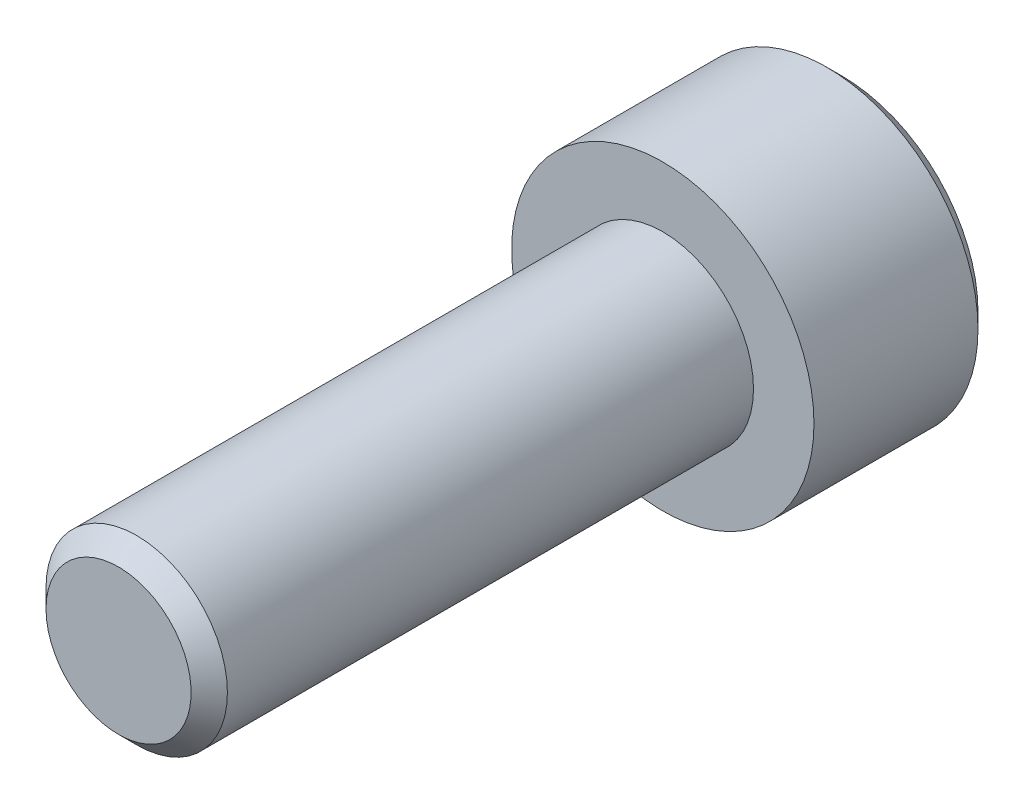
ISO-10303-21;
HEADER;
FILE_DESCRIPTION(('STEP AP214'),'2;1');
FILE_NAME('part.step','',(''),(''),'','','');
FILE_SCHEMA(('AUTOMOTIVE_DESIGN { 1 0 10303 214 1 1 1 1 }'));
ENDSEC;
DATA;
#1=APPLICATION_CONTEXT('core data for automotive mechanical design processes');
#2=APPLICATION_PROTOCOL_DEFINITION('international standard','automotive_design',2000,#1);
#3=PRODUCT_CONTEXT('',#1,'mechanical');
#4=PRODUCT('Part','Part','',(#3));
#5=PRODUCT_RELATED_PRODUCT_CATEGORY('part','',(#4));
#6=PRODUCT_DEFINITION_FORMATION('','',#4);
#7=PRODUCT_DEFINITION_CONTEXT('part definition',#1,'design');
#8=PRODUCT_DEFINITION('design','',#6,#7);
#9=PRODUCT_DEFINITION_SHAPE('','',#8);
#10=(LENGTH_UNIT() NAMED_UNIT(*) SI_UNIT(.MILLI.,.METRE.));
#11=(NAMED_UNIT(*) PLANE_ANGLE_UNIT() SI_UNIT($,.RADIAN.));
#12=(NAMED_UNIT(*) SI_UNIT($,.STERADIAN.) SOLID_ANGLE_UNIT());
#13=UNCERTAINTY_MEASURE_WITH_UNIT(LENGTH_MEASURE(1.E-05),#10,'distance_accuracy_value','');
#14=(GEOMETRIC_REPRESENTATION_CONTEXT(3) GLOBAL_UNCERTAINTY_ASSIGNED_CONTEXT((#13)) GLOBAL_UNIT_ASSIGNED_CONTEXT((#10,
#11,#12)) REPRESENTATION_CONTEXT('',''));
#15=CARTESIAN_POINT('',(0.,0.,0.));
#16=DIRECTION('',(0.,0.,1.));
#17=DIRECTION('',(1.,0.,0.));
#18=AXIS2_PLACEMENT_3D('',#15,#16,#17);
#19=CARTESIAN_POINT('',(0.,0.,-2.925));
#20=DIRECTION('',(0.,0.,1.));
#21=DIRECTION('',(1.,0.,0.));
#22=AXIS2_PLACEMENT_3D('',#19,#20,#21);
#23=PLANE('',#22);
#24=DIRECTION('',(0.,1.,0.));
#25=VECTOR('',#24,1.);
#26=CARTESIAN_POINT('',(-2.5,-1.44337567297406,-2.925));
#27=LINE('',#26,#25);
#28=CARTESIAN_POINT('',(-2.5,-1.44337567297406,-2.925));
#29=VERTEX_POINT('',#28);
#30=CARTESIAN_POINT('',(-2.5,1.44337567297406,-2.925));
#31=VERTEX_POINT('',#30);
#32=EDGE_CURVE('E74',#29,#31,#27,.T.);
#33=ORIENTED_EDGE('',*,*,#32,.T.);
#34=DIRECTION('',(-0.866025403784439,-0.5,0.));
#35=VECTOR('',#34,1.);
#36=CARTESIAN_POINT('',(-2.5,1.44337567297406,-2.925));
#37=LINE('',#36,#35);
#38=CARTESIAN_POINT('',(0.,2.88675134594813,-2.925));
#39=VERTEX_POINT('',#38);
#40=EDGE_CURVE('E71',#31,#39,#37,.F.);
#41=ORIENTED_EDGE('',*,*,#40,.T.);
#42=DIRECTION('',(-0.866025403784439,0.5,0.));
#43=VECTOR('',#42,1.);
#44=CARTESIAN_POINT('',(0.,2.88675134594813,-2.925));
#45=LINE('',#44,#43);
#46=CARTESIAN_POINT('',(2.5,1.44337567297406,-2.925));
#47=VERTEX_POINT('',#46);
#48=EDGE_CURVE('E68',#39,#47,#45,.F.);
#49=ORIENTED_EDGE('',*,*,#48,.T.);
#50=DIRECTION('',(0.,1.,0.));
#51=VECTOR('',#50,1.);
#52=CARTESIAN_POINT('',(2.5,1.44337567297406,-2.925));
#53=LINE('',#52,#51);
#54=CARTESIAN_POINT('',(2.5,-1.44337567297406,-2.925));
#55=VERTEX_POINT('',#54);
#56=EDGE_CURVE('E98',#47,#55,#53,.F.);
#57=ORIENTED_EDGE('',*,*,#56,.T.);
#58=DIRECTION('',(0.866025403784439,0.499999999999999,0.));
#59=VECTOR('',#58,1.);
#60=CARTESIAN_POINT('',(2.5,-1.44337567297406,-2.925));
#61=LINE('',#60,#59);
#62=CARTESIAN_POINT('',(0.,-2.88675134594813,-2.925));
#63=VERTEX_POINT('',#62);
#64=EDGE_CURVE('E152',#55,#63,#61,.F.);
#65=ORIENTED_EDGE('',*,*,#64,.T.);
#66=DIRECTION('',(0.866025403784438,-0.5,0.));
#67=VECTOR('',#66,1.);
#68=CARTESIAN_POINT('',(0.,-2.88675134594813,-2.925));
#69=LINE('',#68,#67);
#70=EDGE_CURVE('E146',#63,#29,#69,.F.);
#71=ORIENTED_EDGE('',*,*,#70,.T.);
#72=EDGE_LOOP('',(#33,#41,#49,#57,#65,#71));
#73=FACE_BOUND('',#72,.T.);
#74=ADVANCED_FACE('F16',(#73),#23,.F.);
#75=CARTESIAN_POINT('',(-2.5,1.44337567297406,-5.925));
#76=DIRECTION('',(-0.5,0.866025403784439,0.));
#77=DIRECTION('',(-0.866025403784439,-0.5,0.));
#78=AXIS2_PLACEMENT_3D('',#75,#76,#77);
#79=PLANE('',#78);
#80=ORIENTED_EDGE('',*,*,#40,.F.);
#81=DIRECTION('',(0.,0.,1.));
#82=VECTOR('',#81,1.);
#83=CARTESIAN_POINT('',(-2.5,1.44337567297406,-5.925));
#84=LINE('',#83,#82);
#85=CARTESIAN_POINT('',(-2.5,1.44337567297406,-5.925));
#86=VERTEX_POINT('',#85);
#87=EDGE_CURVE('E139',#31,#86,#84,.F.);
#88=ORIENTED_EDGE('',*,*,#87,.T.);
#89=DIRECTION('',(0.866025403784438,0.500000000000001,0.));
#90=VECTOR('',#89,1.);
#91=CARTESIAN_POINT('',(-2.5,1.44337567297406,-5.925));
#92=LINE('',#91,#90);
#93=CARTESIAN_POINT('',(0.,2.88675134594813,-5.925));
#94=VERTEX_POINT('',#93);
#95=EDGE_CURVE('E83',#86,#94,#92,.T.);
#96=ORIENTED_EDGE('',*,*,#95,.T.);
#97=DIRECTION('',(0.,0.,1.));
#98=VECTOR('',#97,1.);
#99=CARTESIAN_POINT('',(0.,2.88675134594813,-5.925));
#100=LINE('',#99,#98);
#101=EDGE_CURVE('E78',#94,#39,#100,.T.);
#102=ORIENTED_EDGE('',*,*,#101,.T.);
#103=EDGE_LOOP('',(#80,#88,#96,#102));
#104=FACE_BOUND('',#103,.T.);
#105=ADVANCED_FACE('F81',(#104),#79,.F.);
#106=CARTESIAN_POINT('',(0.,2.88675134594813,-5.925));
#107=DIRECTION('',(0.5,0.866025403784439,0.));
#108=DIRECTION('',(-0.866025403784439,0.5,0.));
#109=AXIS2_PLACEMENT_3D('',#106,#107,#108);
#110=PLANE('',#109);
#111=ORIENTED_EDGE('',*,*,#48,.F.);
#112=ORIENTED_EDGE('',*,*,#101,.F.);
#113=DIRECTION('',(0.866025403784438,-0.500000000000001,0.));
#114=VECTOR('',#113,1.);
#115=CARTESIAN_POINT('',(0.,2.88675134594813,-5.925));
#116=LINE('',#115,#114);
#117=CARTESIAN_POINT('',(2.5,1.44337567297406,-5.925));
#118=VERTEX_POINT('',#117);
#119=EDGE_CURVE('E134',#94,#118,#116,.T.);
#120=ORIENTED_EDGE('',*,*,#119,.T.);
#121=DIRECTION('',(0.,0.,-1.));
#122=VECTOR('',#121,1.);
#123=CARTESIAN_POINT('',(2.5,1.44337567297406,-5.925));
#124=LINE('',#123,#122);
#125=EDGE_CURVE('E90',#118,#47,#124,.F.);
#126=ORIENTED_EDGE('',*,*,#125,.T.);
#127=EDGE_LOOP('',(#111,#112,#120,#126));
#128=FACE_BOUND('',#127,.T.);
#129=ADVANCED_FACE('F88',(#128),#110,.F.);
#130=CARTESIAN_POINT('',(2.5,1.44337567297406,-5.925));
#131=DIRECTION('',(1.,0.,0.));
#132=DIRECTION('',(0.,0.,-1.));
#133=AXIS2_PLACEMENT_3D('',#130,#131,#132);
#134=PLANE('',#133);
#135=ORIENTED_EDGE('',*,*,#56,.F.);
#136=ORIENTED_EDGE('',*,*,#125,.F.);
#137=DIRECTION('',(0.,1.,0.));
#138=VECTOR('',#137,1.);
#139=CARTESIAN_POINT('',(2.5,0.,-5.925));
#140=LINE('',#139,#138);
#141=CARTESIAN_POINT('',(2.5,-1.44337567297406,-5.925));
#142=VERTEX_POINT('',#141);
#143=EDGE_CURVE('E131',#118,#142,#140,.F.);
#144=ORIENTED_EDGE('',*,*,#143,.T.);
#145=DIRECTION('',(0.,0.,1.));
#146=VECTOR('',#145,1.);
#147=CARTESIAN_POINT('',(2.5,-1.44337567297406,-5.925));
#148=LINE('',#147,#146);
#149=EDGE_CURVE('E155',#142,#55,#148,.T.);
#150=ORIENTED_EDGE('',*,*,#149,.T.);
#151=EDGE_LOOP('',(#135,#136,#144,#150));
#152=FACE_BOUND('',#151,.T.);
#153=ADVANCED_FACE('F161',(#152),#134,.F.);
#154=CARTESIAN_POINT('',(2.5,-1.44337567297406,-5.925));
#155=DIRECTION('',(0.499999999999999,-0.866025403784439,0.));
#156=DIRECTION('',(0.866025403784439,0.499999999999999,0.));
#157=AXIS2_PLACEMENT_3D('',#154,#155,#156);
#158=PLANE('',#157);
#159=ORIENTED_EDGE('',*,*,#64,.F.);
#160=ORIENTED_EDGE('',*,*,#149,.F.);
#161=DIRECTION('',(-0.866025403784438,-0.500000000000001,0.));
#162=VECTOR('',#161,1.);
#163=CARTESIAN_POINT('',(2.5,-1.44337567297406,-5.925));
#164=LINE('',#163,#162);
#165=CARTESIAN_POINT('',(0.,-2.88675134594813,-5.925));
#166=VERTEX_POINT('',#165);
#167=EDGE_CURVE('E128',#142,#166,#164,.T.);
#168=ORIENTED_EDGE('',*,*,#167,.T.);
#169=DIRECTION('',(0.,0.,1.));
#170=VECTOR('',#169,1.);
#171=CARTESIAN_POINT('',(0.,-2.88675134594813,-5.925));
#172=LINE('',#171,#170);
#173=EDGE_CURVE('E148',#166,#63,#172,.T.);
#174=ORIENTED_EDGE('',*,*,#173,.T.);
#175=EDGE_LOOP('',(#159,#160,#168,#174));
#176=FACE_BOUND('',#175,.T.);
#177=ADVANCED_FACE('F165',(#176),#158,.F.);
#178=CARTESIAN_POINT('',(0.,-2.88675134594813,-5.925));
#179=DIRECTION('',(-0.5,-0.866025403784438,0.));
#180=DIRECTION('',(0.866025403784438,-0.5,0.));
#181=AXIS2_PLACEMENT_3D('',#178,#179,#180);
#182=PLANE('',#181);
#183=ORIENTED_EDGE('',*,*,#70,.F.);
#184=ORIENTED_EDGE('',*,*,#173,.F.);
#185=DIRECTION('',(-0.866025403784438,0.500000000000002,0.));
#186=VECTOR('',#185,1.);
#187=CARTESIAN_POINT('',(0.,-2.88675134594813,-5.925));
#188=LINE('',#187,#186);
#189=CARTESIAN_POINT('',(-2.5,-1.44337567297406,-5.925));
#190=VERTEX_POINT('',#189);
#191=EDGE_CURVE('E35',#166,#190,#188,.T.);
#192=ORIENTED_EDGE('',*,*,#191,.T.);
#193=DIRECTION('',(0.,0.,1.));
#194=VECTOR('',#193,1.);
#195=CARTESIAN_POINT('',(-2.5,-1.44337567297406,-5.925));
#196=LINE('',#195,#194);
#197=EDGE_CURVE('E144',#190,#29,#196,.T.);
#198=ORIENTED_EDGE('',*,*,#197,.T.);
#199=EDGE_LOOP('',(#183,#184,#192,#198));
#200=FACE_BOUND('',#199,.T.);
#201=ADVANCED_FACE('F167',(#200),#182,.F.);
#202=CARTESIAN_POINT('',(-2.5,-1.44337567297406,-5.925));
#203=DIRECTION('',(-1.,0.,0.));
#204=DIRECTION('',(0.,0.,1.));
#205=AXIS2_PLACEMENT_3D('',#202,#203,#204);
#206=PLANE('',#205);
#207=ORIENTED_EDGE('',*,*,#32,.F.);
#208=ORIENTED_EDGE('',*,*,#197,.F.);
#209=DIRECTION('',(0.,1.,0.));
#210=VECTOR('',#209,1.);
#211=CARTESIAN_POINT('',(-2.5,0.,-5.925));
#212=LINE('',#211,#210);
#213=EDGE_CURVE('E120',#190,#86,#212,.T.);
#214=ORIENTED_EDGE('',*,*,#213,.T.);
#215=ORIENTED_EDGE('',*,*,#87,.F.);
#216=EDGE_LOOP('',(#207,#208,#214,#215));
#217=FACE_BOUND('',#216,.T.);
#218=ADVANCED_FACE('F170',(#217),#206,.F.);
#219=CARTESIAN_POINT('',(0.,0.,-5.925));
#220=DIRECTION('',(0.,0.,1.));
#221=DIRECTION('',(1.,0.,0.));
#222=AXIS2_PLACEMENT_3D('',#219,#220,#221);
#223=PLANE('',#222);
#224=ORIENTED_EDGE('',*,*,#191,.F.);
#225=ORIENTED_EDGE('',*,*,#167,.F.);
#226=ORIENTED_EDGE('',*,*,#143,.F.);
#227=ORIENTED_EDGE('',*,*,#119,.F.);
#228=ORIENTED_EDGE('',*,*,#95,.F.);
#229=ORIENTED_EDGE('',*,*,#213,.F.);
#230=EDGE_LOOP('',(#224,#225,#226,#227,#228,#229));
#231=FACE_BOUND('',#230,.T.);
#232=CARTESIAN_POINT('',(0.,0.,-5.92499999999063));
#233=DIRECTION('',(0.,0.,1.));
#234=DIRECTION('',(1.,0.,0.));
#235=AXIS2_PLACEMENT_3D('',#232,#233,#234);
#236=CIRCLE('',#235,4.50000000000728);
#237=CARTESIAN_POINT('',(4.50000000000728,0.,-5.92499999999063));
#238=VERTEX_POINT('',#237);
#239=EDGE_CURVE('E19',#238,#238,#236,.T.);
#240=ORIENTED_EDGE('',*,*,#239,.F.);
#241=EDGE_LOOP('',(#240));
#242=FACE_BOUND('',#241,.T.);
#243=ADVANCED_FACE('F172',(#231,#242),#223,.F.);
#244=CARTESIAN_POINT('',(0.,0.,-5.42500000000246));
#245=DIRECTION('',(0.,0.,1.));
#246=DIRECTION('',(1.,0.,0.));
#247=AXIS2_PLACEMENT_3D('',#244,#245,#246);
#248=CONICAL_SURFACE('',#247,4.99999999999545,0.785398163397448);
#249=ORIENTED_EDGE('',*,*,#239,.T.);
#250=EDGE_LOOP('',(#249));
#251=FACE_BOUND('',#250,.T.);
#252=CARTESIAN_POINT('',(0.,0.,-5.425));
#253=DIRECTION('',(0.,0.,1.));
#254=DIRECTION('',(1.,0.,0.));
#255=AXIS2_PLACEMENT_3D('',#252,#253,#254);
#256=CIRCLE('',#255,5.);
#257=CARTESIAN_POINT('',(5.,0.,-5.425));
#258=VERTEX_POINT('',#257);
#259=EDGE_CURVE('E107',#258,#258,#256,.T.);
#260=ORIENTED_EDGE('',*,*,#259,.F.);
#261=EDGE_LOOP('',(#260));
#262=FACE_BOUND('',#261,.T.);
#263=ADVANCED_FACE('F175',(#251,#262),#248,.T.);
#264=CARTESIAN_POINT('',(0.,0.,18.));
#265=DIRECTION('',(0.,0.,1.));
#266=DIRECTION('',(1.,0.,0.));
#267=AXIS2_PLACEMENT_3D('',#264,#265,#266);
#268=PLANE('',#267);
#269=CARTESIAN_POINT('',(0.,0.,17.9999999999154));
#270=DIRECTION('',(0.,0.,-1.));
#271=DIRECTION('',(-1.,0.,0.));
#272=AXIS2_PLACEMENT_3D('',#269,#270,#271);
#273=CIRCLE('',#272,2.40000000002283);
#274=CARTESIAN_POINT('',(-2.40000000002283,0.,17.9999999999154));
#275=VERTEX_POINT('',#274);
#276=EDGE_CURVE('E105',#275,#275,#273,.T.);
#277=ORIENTED_EDGE('',*,*,#276,.F.);
#278=EDGE_LOOP('',(#277));
#279=FACE_BOUND('',#278,.T.);
#280=ADVANCED_FACE('F181',(#279),#268,.T.);
#281=CARTESIAN_POINT('',(0.,0.,-5.925));
#282=DIRECTION('',(0.,0.,1.));
#283=DIRECTION('',(1.,0.,0.));
#284=AXIS2_PLACEMENT_3D('',#281,#282,#283);
#285=CYLINDRICAL_SURFACE('',#284,5.);
#286=ORIENTED_EDGE('',*,*,#259,.T.);
#287=EDGE_LOOP('',(#286));
#288=FACE_BOUND('',#287,.T.);
#289=CARTESIAN_POINT('',(0.,0.,0.));
#290=DIRECTION('',(0.,0.,1.));
#291=DIRECTION('',(1.,0.,0.));
#292=AXIS2_PLACEMENT_3D('',#289,#290,#291);
#293=CIRCLE('',#292,5.);
#294=CARTESIAN_POINT('',(5.,0.,0.));
#295=VERTEX_POINT('',#294);
#296=EDGE_CURVE('E102',#295,#295,#293,.T.);
#297=ORIENTED_EDGE('',*,*,#296,.F.);
#298=EDGE_LOOP('',(#297));
#299=FACE_BOUND('',#298,.T.);
#300=ADVANCED_FACE('F186',(#288,#299),#285,.T.);
#301=CARTESIAN_POINT('',(0.,0.,17.4000000000092));
#302=DIRECTION('',(0.,0.,-1.));
#303=DIRECTION('',(-1.,0.,0.));
#304=AXIS2_PLACEMENT_3D('',#301,#302,#303);
#305=CONICAL_SURFACE('',#304,2.9999999999859,0.785398163444818);
#306=CARTESIAN_POINT('',(0.,0.,17.4));
#307=DIRECTION('',(0.,0.,1.));
#308=DIRECTION('',(1.,0.,0.));
#309=AXIS2_PLACEMENT_3D('',#306,#307,#308);
#310=CIRCLE('',#309,3.);
#311=CARTESIAN_POINT('',(3.,0.,17.4));
#312=VERTEX_POINT('',#311);
#313=EDGE_CURVE('E26',#312,#312,#310,.F.);
#314=ORIENTED_EDGE('',*,*,#313,.F.);
#315=EDGE_LOOP('',(#314));
#316=FACE_BOUND('',#315,.T.);
#317=ORIENTED_EDGE('',*,*,#276,.T.);
#318=EDGE_LOOP('',(#317));
#319=FACE_BOUND('',#318,.T.);
#320=ADVANCED_FACE('F196',(#316,#319),#305,.T.);
#321=CARTESIAN_POINT('',(0.,0.,0.));
#322=DIRECTION('',(0.,0.,1.));
#323=DIRECTION('',(1.,0.,0.));
#324=AXIS2_PLACEMENT_3D('',#321,#322,#323);
#325=PLANE('',#324);
#326=CARTESIAN_POINT('',(0.,0.,0.));
#327=DIRECTION('',(0.,0.,1.));
#328=DIRECTION('',(1.,0.,0.));
#329=AXIS2_PLACEMENT_3D('',#326,#327,#328);
#330=CIRCLE('',#329,3.);
#331=CARTESIAN_POINT('',(3.,0.,0.));
#332=VERTEX_POINT('',#331);
#333=EDGE_CURVE('E11',#332,#332,#330,.T.);
#334=ORIENTED_EDGE('',*,*,#333,.F.);
#335=EDGE_LOOP('',(#334));
#336=FACE_BOUND('',#335,.T.);
#337=ORIENTED_EDGE('',*,*,#296,.T.);
#338=EDGE_LOOP('',(#337));
#339=FACE_BOUND('',#338,.T.);
#340=ADVANCED_FACE('F191',(#336,#339),#325,.T.);
#341=CARTESIAN_POINT('',(0.,0.,0.));
#342=DIRECTION('',(0.,0.,1.));
#343=DIRECTION('',(1.,0.,0.));
#344=AXIS2_PLACEMENT_3D('',#341,#342,#343);
#345=CYLINDRICAL_SURFACE('',#344,3.);
#346=ORIENTED_EDGE('',*,*,#333,.T.);
#347=EDGE_LOOP('',(#346));
#348=FACE_BOUND('',#347,.T.);
#349=ORIENTED_EDGE('',*,*,#313,.T.);
#350=EDGE_LOOP('',(#349));
#351=FACE_BOUND('',#350,.T.);
#352=ADVANCED_FACE('F189',(#348,#351),#345,.T.);
#353=CLOSED_SHELL('',(#74,#105,#129,#153,#177,#201,#218,#243,#263,#280,#300,#320,#340,#352));
#354=MANIFOLD_SOLID_BREP('B1',#353);
#355=ADVANCED_BREP_SHAPE_REPRESENTATION('',(#18,#354),#14);
#356=SHAPE_DEFINITION_REPRESENTATION(#9,#355);
ENDSEC;
END-ISO-10303-21;
